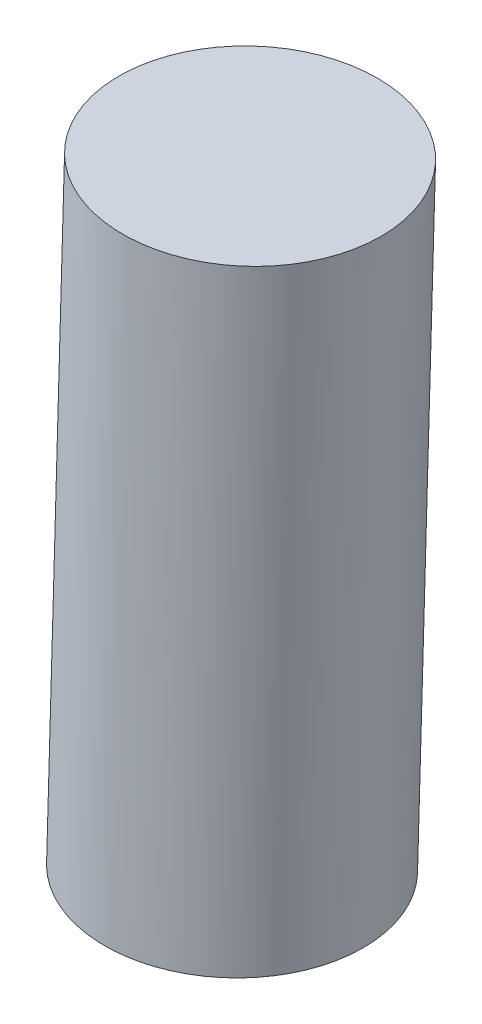
ISO-10303-21;
HEADER;
FILE_DESCRIPTION(('STEP AP214'),'2;1');
FILE_NAME('part.step','',(''),(''),'','','');
FILE_SCHEMA(('AUTOMOTIVE_DESIGN { 1 0 10303 214 1 1 1 1 }'));
ENDSEC;
DATA;
#1=APPLICATION_CONTEXT('core data for automotive mechanical design processes');
#2=APPLICATION_PROTOCOL_DEFINITION('international standard','automotive_design',2000,#1);
#3=PRODUCT_CONTEXT('',#1,'mechanical');
#4=PRODUCT('Part','Part','',(#3));
#5=PRODUCT_RELATED_PRODUCT_CATEGORY('part','',(#4));
#6=PRODUCT_DEFINITION_FORMATION('','',#4);
#7=PRODUCT_DEFINITION_CONTEXT('part definition',#1,'design');
#8=PRODUCT_DEFINITION('design','',#6,#7);
#9=PRODUCT_DEFINITION_SHAPE('','',#8);
#10=(LENGTH_UNIT() NAMED_UNIT(*) SI_UNIT(.MILLI.,.METRE.));
#11=(NAMED_UNIT(*) PLANE_ANGLE_UNIT() SI_UNIT($,.RADIAN.));
#12=(NAMED_UNIT(*) SI_UNIT($,.STERADIAN.) SOLID_ANGLE_UNIT());
#13=UNCERTAINTY_MEASURE_WITH_UNIT(LENGTH_MEASURE(1.E-05),#10,'distance_accuracy_value','');
#14=(GEOMETRIC_REPRESENTATION_CONTEXT(3) GLOBAL_UNCERTAINTY_ASSIGNED_CONTEXT((#13)) GLOBAL_UNIT_ASSIGNED_CONTEXT((#10,
#11,#12)) REPRESENTATION_CONTEXT('',''));
#15=CARTESIAN_POINT('',(0.,0.,0.));
#16=DIRECTION('',(0.,0.,1.));
#17=DIRECTION('',(1.,0.,0.));
#18=AXIS2_PLACEMENT_3D('',#15,#16,#17);
#19=CARTESIAN_POINT('',(-224.214520334433,-4.98537849313772,-92.9921405114));
#20=DIRECTION('',(-0.0287732149581045,-0.999585965338137,0.));
#21=DIRECTION('',(0.999585965338136,-0.0287732149581045,0.));
#22=AXIS2_PLACEMENT_3D('',#19,#20,#21);
#23=CYLINDRICAL_SURFACE('',#22,7.);
#24=CARTESIAN_POINT('',(-224.220313220277,-5.18662424885087,-92.9921405114));
#25=DIRECTION('',(-0.0287732149581045,-0.999585965338137,0.));
#26=DIRECTION('',(0.999585965338136,-0.0287732149581045,0.));
#27=AXIS2_PLACEMENT_3D('',#24,#25,#26);
#28=CIRCLE('',#27,6.99999999999997);
#29=CARTESIAN_POINT('',(-217.22321146291,-5.3880367535576,-92.9921405114));
#30=VERTEX_POINT('',#29);
#31=EDGE_CURVE('E10',#30,#30,#28,.T.);
#32=ORIENTED_EDGE('',*,*,#31,.T.);
#33=EDGE_LOOP('',(#32));
#34=FACE_BOUND('',#33,.T.);
#35=CARTESIAN_POINT('',(-225.180339885721,-38.5381000058891,-92.9921405114));
#36=DIRECTION('',(-0.0287732149581045,-0.999585965338137,0.));
#37=DIRECTION('',(0.999585965338136,-0.0287732149581045,0.));
#38=AXIS2_PLACEMENT_3D('',#35,#36,#37);
#39=CIRCLE('',#38,7.00000000000001);
#40=CARTESIAN_POINT('',(-218.183238128354,-38.7395125105959,-92.9921405114));
#41=VERTEX_POINT('',#40);
#42=EDGE_CURVE('E44',#41,#41,#39,.T.);
#43=ORIENTED_EDGE('',*,*,#42,.F.);
#44=EDGE_LOOP('',(#43));
#45=FACE_BOUND('',#44,.T.);
#46=ADVANCED_FACE('F38',(#34,#45),#23,.T.);
#47=CARTESIAN_POINT('',(-217.223211462911,-5.38803675355971,-92.9921405114));
#48=DIRECTION('',(0.0287732149581045,0.999585965338137,0.));
#49=DIRECTION('',(-0.999585965338136,0.0287732149581045,0.));
#50=AXIS2_PLACEMENT_3D('',#47,#48,#49);
#51=PLANE('',#50);
#52=ORIENTED_EDGE('',*,*,#31,.F.);
#53=EDGE_LOOP('',(#52));
#54=FACE_BOUND('',#53,.T.);
#55=ADVANCED_FACE('F53',(#54),#51,.T.);
#56=CARTESIAN_POINT('',(-225.180339885721,-38.5381000059007,-92.9921405114));
#57=DIRECTION('',(-0.0287732149581045,-0.999585965338137,0.));
#58=DIRECTION('',(0.999585965338136,-0.0287732149581045,0.));
#59=AXIS2_PLACEMENT_3D('',#56,#57,#58);
#60=PLANE('',#59);
#61=ORIENTED_EDGE('',*,*,#42,.T.);
#62=EDGE_LOOP('',(#61));
#63=FACE_BOUND('',#62,.T.);
#64=ADVANCED_FACE('F50',(#63),#60,.T.);
#65=CLOSED_SHELL('',(#46,#55,#64));
#66=MANIFOLD_SOLID_BREP('B2',#65);
#67=ADVANCED_BREP_SHAPE_REPRESENTATION('',(#18,#66),#14);
#68=SHAPE_DEFINITION_REPRESENTATION(#9,#67);
ENDSEC;
END-ISO-10303-21;
